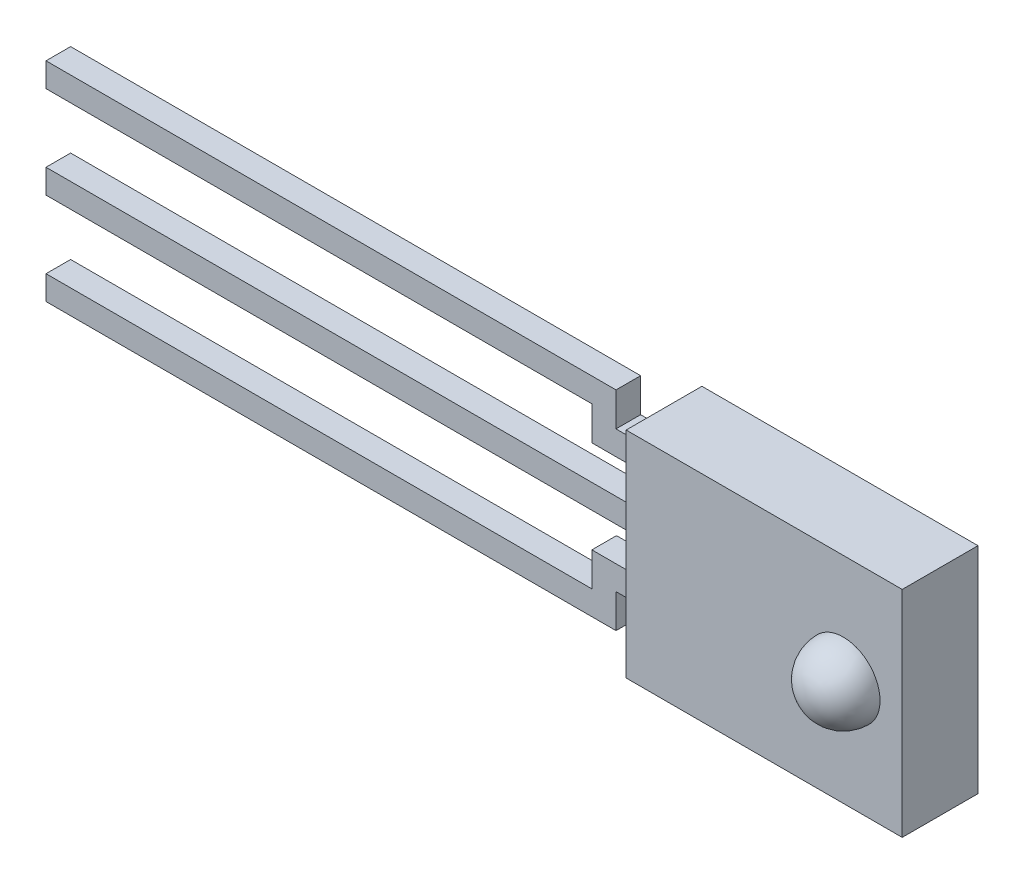
ISO-10303-21;
HEADER;
FILE_DESCRIPTION(('STEP AP214'),'2;1');
FILE_NAME('part.step','',(''),(''),'','','');
FILE_SCHEMA(('AUTOMOTIVE_DESIGN { 1 0 10303 214 1 1 1 1 }'));
ENDSEC;
DATA;
#1=APPLICATION_CONTEXT('core data for automotive mechanical design processes');
#2=APPLICATION_PROTOCOL_DEFINITION('international standard','automotive_design',2000,#1);
#3=PRODUCT_CONTEXT('',#1,'mechanical');
#4=PRODUCT('Part','Part','',(#3));
#5=PRODUCT_RELATED_PRODUCT_CATEGORY('part','',(#4));
#6=PRODUCT_DEFINITION_FORMATION('','',#4);
#7=PRODUCT_DEFINITION_CONTEXT('part definition',#1,'design');
#8=PRODUCT_DEFINITION('design','',#6,#7);
#9=PRODUCT_DEFINITION_SHAPE('','',#8);
#10=(LENGTH_UNIT() NAMED_UNIT(*) SI_UNIT(.MILLI.,.METRE.));
#11=(NAMED_UNIT(*) PLANE_ANGLE_UNIT() SI_UNIT($,.RADIAN.));
#12=(NAMED_UNIT(*) SI_UNIT($,.STERADIAN.) SOLID_ANGLE_UNIT());
#13=UNCERTAINTY_MEASURE_WITH_UNIT(LENGTH_MEASURE(1.E-05),#10,'distance_accuracy_value','');
#14=(GEOMETRIC_REPRESENTATION_CONTEXT(3) GLOBAL_UNCERTAINTY_ASSIGNED_CONTEXT((#13)) GLOBAL_UNIT_ASSIGNED_CONTEXT((#10,
#11,#12)) REPRESENTATION_CONTEXT('',''));
#15=CARTESIAN_POINT('',(0.,0.,0.));
#16=DIRECTION('',(0.,0.,1.));
#17=DIRECTION('',(1.,0.,0.));
#18=AXIS2_PLACEMENT_3D('',#15,#16,#17);
#19=CARTESIAN_POINT('',(-4.5,2.225,1.57));
#20=DIRECTION('',(1.,0.,0.));
#21=DIRECTION('',(0.,1.,0.));
#22=AXIS2_PLACEMENT_3D('',#19,#20,#21);
#23=PLANE('',#22);
#24=DIRECTION('',(0.,0.,1.));
#25=VECTOR('',#24,1.);
#26=CARTESIAN_POINT('',(-4.5,-0.250000000000001,0.38));
#27=LINE('',#26,#25);
#28=CARTESIAN_POINT('',(-4.5,-0.250000000000001,0.38));
#29=VERTEX_POINT('',#28);
#30=CARTESIAN_POINT('',(-4.5,-0.250000000000002,0.89));
#31=VERTEX_POINT('',#30);
#32=EDGE_CURVE('E51',#29,#31,#27,.T.);
#33=ORIENTED_EDGE('',*,*,#32,.F.);
#34=DIRECTION('',(0.,1.,0.));
#35=VECTOR('',#34,1.);
#36=CARTESIAN_POINT('',(-4.5,0.249999999999999,0.38));
#37=LINE('',#36,#35);
#38=CARTESIAN_POINT('',(-4.5,0.249999999999999,0.38));
#39=VERTEX_POINT('',#38);
#40=EDGE_CURVE('E55',#29,#39,#37,.T.);
#41=ORIENTED_EDGE('',*,*,#40,.T.);
#42=DIRECTION('',(0.,0.,1.));
#43=VECTOR('',#42,1.);
#44=CARTESIAN_POINT('',(-4.5,0.249999999999999,0.38));
#45=LINE('',#44,#43);
#46=CARTESIAN_POINT('',(-4.5,0.249999999999999,0.89));
#47=VERTEX_POINT('',#46);
#48=EDGE_CURVE('E207',#39,#47,#45,.T.);
#49=ORIENTED_EDGE('',*,*,#48,.T.);
#50=DIRECTION('',(0.,1.,0.));
#51=VECTOR('',#50,1.);
#52=CARTESIAN_POINT('',(-4.5,0.249999999999999,0.89));
#53=LINE('',#52,#51);
#54=EDGE_CURVE('E222',#31,#47,#53,.T.);
#55=ORIENTED_EDGE('',*,*,#54,.F.);
#56=EDGE_LOOP('',(#33,#41,#49,#55));
#57=FACE_BOUND('',#56,.T.);
#58=DIRECTION('',(0.,1.,0.));
#59=VECTOR('',#58,1.);
#60=CARTESIAN_POINT('',(-4.5,0.959999999999998,0.38));
#61=LINE('',#60,#59);
#62=CARTESIAN_POINT('',(-4.5,0.959999999999998,0.38));
#63=VERTEX_POINT('',#62);
#64=CARTESIAN_POINT('',(-4.5,1.46,0.38));
#65=VERTEX_POINT('',#64);
#66=EDGE_CURVE('E291',#63,#65,#61,.T.);
#67=ORIENTED_EDGE('',*,*,#66,.T.);
#68=DIRECTION('',(0.,0.,1.));
#69=VECTOR('',#68,1.);
#70=CARTESIAN_POINT('',(-4.5,1.46,0.38));
#71=LINE('',#70,#69);
#72=CARTESIAN_POINT('',(-4.5,1.46,0.89));
#73=VERTEX_POINT('',#72);
#74=EDGE_CURVE('E316',#65,#73,#71,.T.);
#75=ORIENTED_EDGE('',*,*,#74,.T.);
#76=DIRECTION('',(0.,1.,0.));
#77=VECTOR('',#76,1.);
#78=CARTESIAN_POINT('',(-4.5,0.959999999999998,0.89));
#79=LINE('',#78,#77);
#80=CARTESIAN_POINT('',(-4.5,0.959999999999998,0.89));
#81=VERTEX_POINT('',#80);
#82=EDGE_CURVE('E270',#81,#73,#79,.T.);
#83=ORIENTED_EDGE('',*,*,#82,.F.);
#84=DIRECTION('',(0.,0.,1.));
#85=VECTOR('',#84,1.);
#86=CARTESIAN_POINT('',(-4.5,0.959999999999998,0.38));
#87=LINE('',#86,#85);
#88=EDGE_CURVE('E338',#63,#81,#87,.T.);
#89=ORIENTED_EDGE('',*,*,#88,.F.);
#90=EDGE_LOOP('',(#67,#75,#83,#89));
#91=FACE_BOUND('',#90,.T.);
#92=DIRECTION('',(0.,-1.,0.));
#93=VECTOR('',#92,1.);
#94=CARTESIAN_POINT('',(-4.5,2.225,0.));
#95=LINE('',#94,#93);
#96=CARTESIAN_POINT('',(-4.5,2.225,0.));
#97=VERTEX_POINT('',#96);
#98=CARTESIAN_POINT('',(-4.5,-2.225,0.));
#99=VERTEX_POINT('',#98);
#100=EDGE_CURVE('E371',#97,#99,#95,.T.);
#101=ORIENTED_EDGE('',*,*,#100,.T.);
#102=DIRECTION('',(0.,0.,-1.));
#103=VECTOR('',#102,1.);
#104=CARTESIAN_POINT('',(-4.5,-2.225,1.57));
#105=LINE('',#104,#103);
#106=CARTESIAN_POINT('',(-4.5,-2.225,1.57));
#107=VERTEX_POINT('',#106);
#108=EDGE_CURVE('E376',#107,#99,#105,.T.);
#109=ORIENTED_EDGE('',*,*,#108,.F.);
#110=DIRECTION('',(0.,-1.,0.));
#111=VECTOR('',#110,1.);
#112=CARTESIAN_POINT('',(-4.5,2.225,1.57));
#113=LINE('',#112,#111);
#114=CARTESIAN_POINT('',(-4.5,2.225,1.57));
#115=VERTEX_POINT('',#114);
#116=EDGE_CURVE('E361',#115,#107,#113,.T.);
#117=ORIENTED_EDGE('',*,*,#116,.F.);
#118=DIRECTION('',(0.,0.,-1.));
#119=VECTOR('',#118,1.);
#120=CARTESIAN_POINT('',(-4.5,2.225,1.57));
#121=LINE('',#120,#119);
#122=EDGE_CURVE('E44',#115,#97,#121,.T.);
#123=ORIENTED_EDGE('',*,*,#122,.T.);
#124=EDGE_LOOP('',(#101,#109,#117,#123));
#125=FACE_BOUND('',#124,.T.);
#126=DIRECTION('',(0.,-1.,0.));
#127=VECTOR('',#126,1.);
#128=CARTESIAN_POINT('',(-4.5,-0.959999999999998,0.38));
#129=LINE('',#128,#127);
#130=CARTESIAN_POINT('',(-4.5,-0.959999999999998,0.38));
#131=VERTEX_POINT('',#130);
#132=CARTESIAN_POINT('',(-4.5,-1.46,0.38));
#133=VERTEX_POINT('',#132);
#134=EDGE_CURVE('E234',#131,#133,#129,.T.);
#135=ORIENTED_EDGE('',*,*,#134,.F.);
#136=DIRECTION('',(0.,0.,1.));
#137=VECTOR('',#136,1.);
#138=CARTESIAN_POINT('',(-4.5,-0.959999999999998,0.38));
#139=LINE('',#138,#137);
#140=CARTESIAN_POINT('',(-4.5,-0.959999999999998,0.89));
#141=VERTEX_POINT('',#140);
#142=EDGE_CURVE('E252',#131,#141,#139,.T.);
#143=ORIENTED_EDGE('',*,*,#142,.T.);
#144=DIRECTION('',(0.,-1.,0.));
#145=VECTOR('',#144,1.);
#146=CARTESIAN_POINT('',(-4.5,-0.959999999999998,0.89));
#147=LINE('',#146,#145);
#148=CARTESIAN_POINT('',(-4.5,-1.46,0.89));
#149=VERTEX_POINT('',#148);
#150=EDGE_CURVE('E231',#141,#149,#147,.T.);
#151=ORIENTED_EDGE('',*,*,#150,.T.);
#152=DIRECTION('',(0.,0.,1.));
#153=VECTOR('',#152,1.);
#154=CARTESIAN_POINT('',(-4.5,-1.46,0.38));
#155=LINE('',#154,#153);
#156=EDGE_CURVE('E268',#133,#149,#155,.T.);
#157=ORIENTED_EDGE('',*,*,#156,.F.);
#158=EDGE_LOOP('',(#135,#143,#151,#157));
#159=FACE_BOUND('',#158,.T.);
#160=ADVANCED_FACE('F35',(#57,#91,#125,#159),#23,.F.);
#161=CARTESIAN_POINT('',(1.22,2.225,1.57));
#162=DIRECTION('',(-1.,0.,0.));
#163=DIRECTION('',(0.,-1.,0.));
#164=AXIS2_PLACEMENT_3D('',#161,#162,#163);
#165=PLANE('',#164);
#166=DIRECTION('',(0.,1.,0.));
#167=VECTOR('',#166,1.);
#168=CARTESIAN_POINT('',(1.22,2.225,0.));
#169=LINE('',#168,#167);
#170=CARTESIAN_POINT('',(1.22,-2.225,0.));
#171=VERTEX_POINT('',#170);
#172=CARTESIAN_POINT('',(1.22,2.225,0.));
#173=VERTEX_POINT('',#172);
#174=EDGE_CURVE('E366',#171,#173,#169,.T.);
#175=ORIENTED_EDGE('',*,*,#174,.T.);
#176=DIRECTION('',(0.,0.,-1.));
#177=VECTOR('',#176,1.);
#178=CARTESIAN_POINT('',(1.22,2.225,1.57));
#179=LINE('',#178,#177);
#180=CARTESIAN_POINT('',(1.22,2.225,1.57));
#181=VERTEX_POINT('',#180);
#182=EDGE_CURVE('E11',#181,#173,#179,.T.);
#183=ORIENTED_EDGE('',*,*,#182,.F.);
#184=DIRECTION('',(0.,1.,0.));
#185=VECTOR('',#184,1.);
#186=CARTESIAN_POINT('',(1.22,2.225,1.57));
#187=LINE('',#186,#185);
#188=CARTESIAN_POINT('',(1.22,-2.225,1.57));
#189=VERTEX_POINT('',#188);
#190=EDGE_CURVE('E355',#189,#181,#187,.T.);
#191=ORIENTED_EDGE('',*,*,#190,.F.);
#192=DIRECTION('',(0.,0.,-1.));
#193=VECTOR('',#192,1.);
#194=CARTESIAN_POINT('',(1.22,-2.225,1.57));
#195=LINE('',#194,#193);
#196=EDGE_CURVE('E365',#189,#171,#195,.T.);
#197=ORIENTED_EDGE('',*,*,#196,.T.);
#198=EDGE_LOOP('',(#175,#183,#191,#197));
#199=FACE_BOUND('',#198,.T.);
#200=ADVANCED_FACE('F37',(#199),#165,.F.);
#201=CARTESIAN_POINT('',(-4.5,2.225,1.57));
#202=DIRECTION('',(0.,-1.,0.));
#203=DIRECTION('',(0.,0.,-1.));
#204=AXIS2_PLACEMENT_3D('',#201,#202,#203);
#205=PLANE('',#204);
#206=DIRECTION('',(-1.,0.,0.));
#207=VECTOR('',#206,1.);
#208=CARTESIAN_POINT('',(-4.5,2.225,0.));
#209=LINE('',#208,#207);
#210=EDGE_CURVE('E369',#173,#97,#209,.T.);
#211=ORIENTED_EDGE('',*,*,#210,.T.);
#212=ORIENTED_EDGE('',*,*,#122,.F.);
#213=DIRECTION('',(-1.,0.,0.));
#214=VECTOR('',#213,1.);
#215=CARTESIAN_POINT('',(-4.5,2.225,1.57));
#216=LINE('',#215,#214);
#217=EDGE_CURVE('E358',#181,#115,#216,.T.);
#218=ORIENTED_EDGE('',*,*,#217,.F.);
#219=ORIENTED_EDGE('',*,*,#182,.T.);
#220=EDGE_LOOP('',(#211,#212,#218,#219));
#221=FACE_BOUND('',#220,.T.);
#222=ADVANCED_FACE('F400',(#221),#205,.F.);
#223=CARTESIAN_POINT('',(-4.5,-2.225,1.57));
#224=DIRECTION('',(0.,1.,0.));
#225=DIRECTION('',(0.,0.,1.));
#226=AXIS2_PLACEMENT_3D('',#223,#224,#225);
#227=PLANE('',#226);
#228=DIRECTION('',(1.,0.,0.));
#229=VECTOR('',#228,1.);
#230=CARTESIAN_POINT('',(-4.5,-2.225,0.));
#231=LINE('',#230,#229);
#232=EDGE_CURVE('E359',#99,#171,#231,.T.);
#233=ORIENTED_EDGE('',*,*,#232,.T.);
#234=ORIENTED_EDGE('',*,*,#196,.F.);
#235=DIRECTION('',(1.,0.,0.));
#236=VECTOR('',#235,1.);
#237=CARTESIAN_POINT('',(-4.5,-2.225,1.57));
#238=LINE('',#237,#236);
#239=EDGE_CURVE('E363',#107,#189,#238,.T.);
#240=ORIENTED_EDGE('',*,*,#239,.F.);
#241=ORIENTED_EDGE('',*,*,#108,.T.);
#242=EDGE_LOOP('',(#233,#234,#240,#241));
#243=FACE_BOUND('',#242,.T.);
#244=ADVANCED_FACE('F393',(#243),#227,.F.);
#245=CARTESIAN_POINT('',(0.,0.,1.57));
#246=DIRECTION('',(0.,0.,1.));
#247=DIRECTION('',(1.,0.,0.));
#248=AXIS2_PLACEMENT_3D('',#245,#246,#247);
#249=PLANE('',#248);
#250=CARTESIAN_POINT('',(0.,0.,1.57));
#251=DIRECTION('',(0.,0.,1.));
#252=DIRECTION('',(1.,0.,0.));
#253=AXIS2_PLACEMENT_3D('',#250,#251,#252);
#254=CIRCLE('',#253,0.76);
#255=CARTESIAN_POINT('',(0.76,0.,1.57));
#256=VERTEX_POINT('',#255);
#257=EDGE_CURVE('E39',#256,#256,#254,.F.);
#258=ORIENTED_EDGE('',*,*,#257,.T.);
#259=EDGE_LOOP('',(#258));
#260=FACE_BOUND('',#259,.T.);
#261=ORIENTED_EDGE('',*,*,#190,.T.);
#262=ORIENTED_EDGE('',*,*,#217,.T.);
#263=ORIENTED_EDGE('',*,*,#116,.T.);
#264=ORIENTED_EDGE('',*,*,#239,.T.);
#265=EDGE_LOOP('',(#261,#262,#263,#264));
#266=FACE_BOUND('',#265,.T.);
#267=ADVANCED_FACE('F399',(#260,#266),#249,.T.);
#268=CARTESIAN_POINT('',(0.,0.,0.));
#269=DIRECTION('',(0.,0.,1.));
#270=DIRECTION('',(1.,0.,0.));
#271=AXIS2_PLACEMENT_3D('',#268,#269,#270);
#272=PLANE('',#271);
#273=ORIENTED_EDGE('',*,*,#174,.F.);
#274=ORIENTED_EDGE('',*,*,#232,.F.);
#275=ORIENTED_EDGE('',*,*,#100,.F.);
#276=ORIENTED_EDGE('',*,*,#210,.F.);
#277=EDGE_LOOP('',(#273,#274,#275,#276));
#278=FACE_BOUND('',#277,.T.);
#279=ADVANCED_FACE('F390',(#278),#272,.F.);
#280=CARTESIAN_POINT('',(0.,0.,1.57));
#281=DIRECTION('',(0.,0.,-1.));
#282=DIRECTION('',(-1.,0.,0.));
#283=AXIS2_PLACEMENT_3D('',#280,#281,#282);
#284=SPHERICAL_SURFACE('',#283,0.76);
#285=ORIENTED_EDGE('',*,*,#257,.F.);
#286=EDGE_LOOP('',(#285));
#287=FACE_BOUND('',#286,.T.);
#288=ADVANCED_FACE('F415',(#287),#284,.T.);
#289=CARTESIAN_POINT('',(-5.89,0.959999999999998,0.38));
#290=DIRECTION('',(0.,-1.,0.));
#291=DIRECTION('',(1.,0.,0.));
#292=AXIS2_PLACEMENT_3D('',#289,#290,#291);
#293=PLANE('',#292);
#294=DIRECTION('',(1.,0.,0.));
#295=VECTOR('',#294,1.);
#296=CARTESIAN_POINT('',(-5.89,0.959999999999998,0.89));
#297=LINE('',#296,#295);
#298=CARTESIAN_POINT('',(-5.89,0.959999999999998,0.89));
#299=VERTEX_POINT('',#298);
#300=EDGE_CURVE('E295',#299,#81,#297,.T.);
#301=ORIENTED_EDGE('',*,*,#300,.F.);
#302=DIRECTION('',(0.,0.,1.));
#303=VECTOR('',#302,1.);
#304=CARTESIAN_POINT('',(-5.89,0.959999999999998,0.38));
#305=LINE('',#304,#303);
#306=CARTESIAN_POINT('',(-5.89,0.959999999999998,0.38));
#307=VERTEX_POINT('',#306);
#308=EDGE_CURVE('E341',#307,#299,#305,.T.);
#309=ORIENTED_EDGE('',*,*,#308,.F.);
#310=DIRECTION('',(1.,0.,0.));
#311=VECTOR('',#310,1.);
#312=CARTESIAN_POINT('',(-5.89,0.959999999999998,0.38));
#313=LINE('',#312,#311);
#314=EDGE_CURVE('E313',#307,#63,#313,.T.);
#315=ORIENTED_EDGE('',*,*,#314,.T.);
#316=ORIENTED_EDGE('',*,*,#88,.T.);
#317=EDGE_LOOP('',(#301,#309,#315,#316));
#318=FACE_BOUND('',#317,.T.);
#319=ADVANCED_FACE('F421',(#318),#293,.T.);
#320=CARTESIAN_POINT('',(-5.89,1.66,0.38));
#321=DIRECTION('',(-1.,0.,0.));
#322=DIRECTION('',(0.,0.,1.));
#323=AXIS2_PLACEMENT_3D('',#320,#321,#322);
#324=PLANE('',#323);
#325=DIRECTION('',(0.,-1.,0.));
#326=VECTOR('',#325,1.);
#327=CARTESIAN_POINT('',(-5.89,1.66,0.89));
#328=LINE('',#327,#326);
#329=CARTESIAN_POINT('',(-5.89,1.66,0.89));
#330=VERTEX_POINT('',#329);
#331=EDGE_CURVE('E334',#330,#299,#328,.T.);
#332=ORIENTED_EDGE('',*,*,#331,.F.);
#333=DIRECTION('',(0.,0.,1.));
#334=VECTOR('',#333,1.);
#335=CARTESIAN_POINT('',(-5.89,1.66,0.38));
#336=LINE('',#335,#334);
#337=CARTESIAN_POINT('',(-5.89,1.66,0.38));
#338=VERTEX_POINT('',#337);
#339=EDGE_CURVE('E343',#338,#330,#336,.T.);
#340=ORIENTED_EDGE('',*,*,#339,.F.);
#341=DIRECTION('',(0.,-1.,0.));
#342=VECTOR('',#341,1.);
#343=CARTESIAN_POINT('',(-5.89,1.66,0.38));
#344=LINE('',#343,#342);
#345=EDGE_CURVE('E310',#338,#307,#344,.T.);
#346=ORIENTED_EDGE('',*,*,#345,.T.);
#347=ORIENTED_EDGE('',*,*,#308,.T.);
#348=EDGE_LOOP('',(#332,#340,#346,#347));
#349=FACE_BOUND('',#348,.T.);
#350=ADVANCED_FACE('F443',(#349),#324,.T.);
#351=CARTESIAN_POINT('',(-17.2,1.66,0.38));
#352=DIRECTION('',(0.,-1.,0.));
#353=DIRECTION('',(0.,0.,-1.));
#354=AXIS2_PLACEMENT_3D('',#351,#352,#353);
#355=PLANE('',#354);
#356=DIRECTION('',(1.,0.,0.));
#357=VECTOR('',#356,1.);
#358=CARTESIAN_POINT('',(-17.2,1.66,0.89));
#359=LINE('',#358,#357);
#360=CARTESIAN_POINT('',(-17.2,1.66,0.89));
#361=VERTEX_POINT('',#360);
#362=EDGE_CURVE('E331',#361,#330,#359,.T.);
#363=ORIENTED_EDGE('',*,*,#362,.F.);
#364=DIRECTION('',(0.,0.,1.));
#365=VECTOR('',#364,1.);
#366=CARTESIAN_POINT('',(-17.2,1.66,0.38));
#367=LINE('',#366,#365);
#368=CARTESIAN_POINT('',(-17.2,1.66,0.38));
#369=VERTEX_POINT('',#368);
#370=EDGE_CURVE('E345',#369,#361,#367,.T.);
#371=ORIENTED_EDGE('',*,*,#370,.F.);
#372=DIRECTION('',(1.,0.,0.));
#373=VECTOR('',#372,1.);
#374=CARTESIAN_POINT('',(-17.2,1.66,0.38));
#375=LINE('',#374,#373);
#376=EDGE_CURVE('E307',#369,#338,#375,.T.);
#377=ORIENTED_EDGE('',*,*,#376,.T.);
#378=ORIENTED_EDGE('',*,*,#339,.T.);
#379=EDGE_LOOP('',(#363,#371,#377,#378));
#380=FACE_BOUND('',#379,.T.);
#381=ADVANCED_FACE('F439',(#380),#355,.T.);
#382=CARTESIAN_POINT('',(-17.2,2.16,0.38));
#383=DIRECTION('',(-1.,0.,0.));
#384=DIRECTION('',(0.,0.,1.));
#385=AXIS2_PLACEMENT_3D('',#382,#383,#384);
#386=PLANE('',#385);
#387=DIRECTION('',(0.,-1.,0.));
#388=VECTOR('',#387,1.);
#389=CARTESIAN_POINT('',(-17.2,2.16,0.89));
#390=LINE('',#389,#388);
#391=CARTESIAN_POINT('',(-17.2,2.16,0.89));
#392=VERTEX_POINT('',#391);
#393=EDGE_CURVE('E328',#392,#361,#390,.T.);
#394=ORIENTED_EDGE('',*,*,#393,.F.);
#395=DIRECTION('',(0.,0.,1.));
#396=VECTOR('',#395,1.);
#397=CARTESIAN_POINT('',(-17.2,2.16,0.38));
#398=LINE('',#397,#396);
#399=CARTESIAN_POINT('',(-17.2,2.16,0.38));
#400=VERTEX_POINT('',#399);
#401=EDGE_CURVE('E347',#400,#392,#398,.T.);
#402=ORIENTED_EDGE('',*,*,#401,.F.);
#403=DIRECTION('',(0.,-1.,0.));
#404=VECTOR('',#403,1.);
#405=CARTESIAN_POINT('',(-17.2,2.16,0.38));
#406=LINE('',#405,#404);
#407=EDGE_CURVE('E304',#400,#369,#406,.T.);
#408=ORIENTED_EDGE('',*,*,#407,.T.);
#409=ORIENTED_EDGE('',*,*,#370,.T.);
#410=EDGE_LOOP('',(#394,#402,#408,#409));
#411=FACE_BOUND('',#410,.T.);
#412=ADVANCED_FACE('F435',(#411),#386,.T.);
#413=CARTESIAN_POINT('',(-5.39,2.16,0.38));
#414=DIRECTION('',(0.,1.,0.));
#415=DIRECTION('',(-1.,0.,0.));
#416=AXIS2_PLACEMENT_3D('',#413,#414,#415);
#417=PLANE('',#416);
#418=DIRECTION('',(-1.,0.,0.));
#419=VECTOR('',#418,1.);
#420=CARTESIAN_POINT('',(-5.39,2.16,0.89));
#421=LINE('',#420,#419);
#422=CARTESIAN_POINT('',(-5.39,2.16,0.89));
#423=VERTEX_POINT('',#422);
#424=EDGE_CURVE('E325',#423,#392,#421,.T.);
#425=ORIENTED_EDGE('',*,*,#424,.F.);
#426=DIRECTION('',(0.,0.,1.));
#427=VECTOR('',#426,1.);
#428=CARTESIAN_POINT('',(-5.39,2.16,0.38));
#429=LINE('',#428,#427);
#430=CARTESIAN_POINT('',(-5.39,2.16,0.38));
#431=VERTEX_POINT('',#430);
#432=EDGE_CURVE('E349',#431,#423,#429,.T.);
#433=ORIENTED_EDGE('',*,*,#432,.F.);
#434=DIRECTION('',(-1.,0.,0.));
#435=VECTOR('',#434,1.);
#436=CARTESIAN_POINT('',(-5.39,2.16,0.38));
#437=LINE('',#436,#435);
#438=EDGE_CURVE('E301',#431,#400,#437,.T.);
#439=ORIENTED_EDGE('',*,*,#438,.T.);
#440=ORIENTED_EDGE('',*,*,#401,.T.);
#441=EDGE_LOOP('',(#425,#433,#439,#440));
#442=FACE_BOUND('',#441,.T.);
#443=ADVANCED_FACE('F431',(#442),#417,.T.);
#444=CARTESIAN_POINT('',(-5.39,1.46,0.38));
#445=DIRECTION('',(1.,0.,0.));
#446=DIRECTION('',(0.,0.,-1.));
#447=AXIS2_PLACEMENT_3D('',#444,#445,#446);
#448=PLANE('',#447);
#449=DIRECTION('',(0.,1.,0.));
#450=VECTOR('',#449,1.);
#451=CARTESIAN_POINT('',(-5.39,1.46,0.89));
#452=LINE('',#451,#450);
#453=CARTESIAN_POINT('',(-5.39,1.46,0.89));
#454=VERTEX_POINT('',#453);
#455=EDGE_CURVE('E322',#454,#423,#452,.T.);
#456=ORIENTED_EDGE('',*,*,#455,.F.);
#457=DIRECTION('',(0.,0.,1.));
#458=VECTOR('',#457,1.);
#459=CARTESIAN_POINT('',(-5.39,1.46,0.38));
#460=LINE('',#459,#458);
#461=CARTESIAN_POINT('',(-5.39,1.46,0.38));
#462=VERTEX_POINT('',#461);
#463=EDGE_CURVE('E351',#462,#454,#460,.T.);
#464=ORIENTED_EDGE('',*,*,#463,.F.);
#465=DIRECTION('',(0.,1.,0.));
#466=VECTOR('',#465,1.);
#467=CARTESIAN_POINT('',(-5.39,1.46,0.38));
#468=LINE('',#467,#466);
#469=EDGE_CURVE('E298',#462,#431,#468,.T.);
#470=ORIENTED_EDGE('',*,*,#469,.T.);
#471=ORIENTED_EDGE('',*,*,#432,.T.);
#472=EDGE_LOOP('',(#456,#464,#470,#471));
#473=FACE_BOUND('',#472,.T.);
#474=ADVANCED_FACE('F427',(#473),#448,.T.);
#475=CARTESIAN_POINT('',(-4.5,1.46,0.38));
#476=DIRECTION('',(0.,1.,0.));
#477=DIRECTION('',(-1.,0.,0.));
#478=AXIS2_PLACEMENT_3D('',#475,#476,#477);
#479=PLANE('',#478);
#480=DIRECTION('',(-1.,0.,0.));
#481=VECTOR('',#480,1.);
#482=CARTESIAN_POINT('',(-4.5,1.46,0.89));
#483=LINE('',#482,#481);
#484=EDGE_CURVE('E319',#73,#454,#483,.T.);
#485=ORIENTED_EDGE('',*,*,#484,.F.);
#486=ORIENTED_EDGE('',*,*,#74,.F.);
#487=DIRECTION('',(-1.,0.,0.));
#488=VECTOR('',#487,1.);
#489=CARTESIAN_POINT('',(-4.5,1.46,0.38));
#490=LINE('',#489,#488);
#491=EDGE_CURVE('E294',#65,#462,#490,.T.);
#492=ORIENTED_EDGE('',*,*,#491,.T.);
#493=ORIENTED_EDGE('',*,*,#463,.T.);
#494=EDGE_LOOP('',(#485,#486,#492,#493));
#495=FACE_BOUND('',#494,.T.);
#496=ADVANCED_FACE('F423',(#495),#479,.T.);
#497=CARTESIAN_POINT('',(0.,0.,0.38));
#498=DIRECTION('',(0.,0.,1.));
#499=DIRECTION('',(1.,0.,0.));
#500=AXIS2_PLACEMENT_3D('',#497,#498,#499);
#501=PLANE('',#500);
#502=ORIENTED_EDGE('',*,*,#66,.F.);
#503=ORIENTED_EDGE('',*,*,#314,.F.);
#504=ORIENTED_EDGE('',*,*,#345,.F.);
#505=ORIENTED_EDGE('',*,*,#376,.F.);
#506=ORIENTED_EDGE('',*,*,#407,.F.);
#507=ORIENTED_EDGE('',*,*,#438,.F.);
#508=ORIENTED_EDGE('',*,*,#469,.F.);
#509=ORIENTED_EDGE('',*,*,#491,.F.);
#510=EDGE_LOOP('',(#502,#503,#504,#505,#506,#507,#508,#509));
#511=FACE_BOUND('',#510,.T.);
#512=ADVANCED_FACE('F426',(#511),#501,.F.);
#513=CARTESIAN_POINT('',(0.,0.,0.89));
#514=DIRECTION('',(0.,0.,1.));
#515=DIRECTION('',(1.,0.,0.));
#516=AXIS2_PLACEMENT_3D('',#513,#514,#515);
#517=PLANE('',#516);
#518=ORIENTED_EDGE('',*,*,#82,.T.);
#519=ORIENTED_EDGE('',*,*,#484,.T.);
#520=ORIENTED_EDGE('',*,*,#455,.T.);
#521=ORIENTED_EDGE('',*,*,#424,.T.);
#522=ORIENTED_EDGE('',*,*,#393,.T.);
#523=ORIENTED_EDGE('',*,*,#362,.T.);
#524=ORIENTED_EDGE('',*,*,#331,.T.);
#525=ORIENTED_EDGE('',*,*,#300,.T.);
#526=EDGE_LOOP('',(#518,#519,#520,#521,#522,#523,#524,#525));
#527=FACE_BOUND('',#526,.T.);
#528=ADVANCED_FACE('F451',(#527),#517,.T.);
#529=CARTESIAN_POINT('',(-4.5,-1.46,0.38));
#530=DIRECTION('',(0.,1.,0.));
#531=DIRECTION('',(-1.,0.,0.));
#532=AXIS2_PLACEMENT_3D('',#529,#530,#531);
#533=PLANE('',#532);
#534=DIRECTION('',(-1.,0.,0.));
#535=VECTOR('',#534,1.);
#536=CARTESIAN_POINT('',(-4.5,-1.46,0.89));
#537=LINE('',#536,#535);
#538=CARTESIAN_POINT('',(-5.39,-1.46,0.89));
#539=VERTEX_POINT('',#538);
#540=EDGE_CURVE('E238',#149,#539,#537,.T.);
#541=ORIENTED_EDGE('',*,*,#540,.T.);
#542=DIRECTION('',(0.,0.,1.));
#543=VECTOR('',#542,1.);
#544=CARTESIAN_POINT('',(-5.39,-1.46,0.38));
#545=LINE('',#544,#543);
#546=CARTESIAN_POINT('',(-5.39,-1.46,0.38));
#547=VERTEX_POINT('',#546);
#548=EDGE_CURVE('E271',#547,#539,#545,.T.);
#549=ORIENTED_EDGE('',*,*,#548,.F.);
#550=DIRECTION('',(-1.,0.,0.));
#551=VECTOR('',#550,1.);
#552=CARTESIAN_POINT('',(-4.5,-1.46,0.38));
#553=LINE('',#552,#551);
#554=EDGE_CURVE('E250',#133,#547,#553,.T.);
#555=ORIENTED_EDGE('',*,*,#554,.F.);
#556=ORIENTED_EDGE('',*,*,#156,.T.);
#557=EDGE_LOOP('',(#541,#549,#555,#556));
#558=FACE_BOUND('',#557,.T.);
#559=ADVANCED_FACE('F454',(#558),#533,.F.);
#560=CARTESIAN_POINT('',(-5.39,-1.46,0.38));
#561=DIRECTION('',(-1.,0.,0.));
#562=DIRECTION('',(0.,0.,1.));
#563=AXIS2_PLACEMENT_3D('',#560,#561,#562);
#564=PLANE('',#563);
#565=DIRECTION('',(0.,-1.,0.));
#566=VECTOR('',#565,1.);
#567=CARTESIAN_POINT('',(-5.39,-1.46,0.89));
#568=LINE('',#567,#566);
#569=CARTESIAN_POINT('',(-5.39,-2.16,0.89));
#570=VERTEX_POINT('',#569);
#571=EDGE_CURVE('E265',#539,#570,#568,.T.);
#572=ORIENTED_EDGE('',*,*,#571,.T.);
#573=DIRECTION('',(0.,0.,1.));
#574=VECTOR('',#573,1.);
#575=CARTESIAN_POINT('',(-5.39,-2.16,0.38));
#576=LINE('',#575,#574);
#577=CARTESIAN_POINT('',(-5.39,-2.16,0.38));
#578=VERTEX_POINT('',#577);
#579=EDGE_CURVE('E274',#578,#570,#576,.T.);
#580=ORIENTED_EDGE('',*,*,#579,.F.);
#581=DIRECTION('',(0.,-1.,0.));
#582=VECTOR('',#581,1.);
#583=CARTESIAN_POINT('',(-5.39,-1.46,0.38));
#584=LINE('',#583,#582);
#585=EDGE_CURVE('E248',#547,#578,#584,.T.);
#586=ORIENTED_EDGE('',*,*,#585,.F.);
#587=ORIENTED_EDGE('',*,*,#548,.T.);
#588=EDGE_LOOP('',(#572,#580,#586,#587));
#589=FACE_BOUND('',#588,.T.);
#590=ADVANCED_FACE('F479',(#589),#564,.F.);
#591=CARTESIAN_POINT('',(-5.39,-2.16,0.38));
#592=DIRECTION('',(0.,1.,0.));
#593=DIRECTION('',(-1.,0.,0.));
#594=AXIS2_PLACEMENT_3D('',#591,#592,#593);
#595=PLANE('',#594);
#596=DIRECTION('',(-1.,0.,0.));
#597=VECTOR('',#596,1.);
#598=CARTESIAN_POINT('',(-5.39,-2.16,0.89));
#599=LINE('',#598,#597);
#600=CARTESIAN_POINT('',(-17.2,-2.16,0.89));
#601=VERTEX_POINT('',#600);
#602=EDGE_CURVE('E263',#570,#601,#599,.T.);
#603=ORIENTED_EDGE('',*,*,#602,.T.);
#604=DIRECTION('',(0.,0.,1.));
#605=VECTOR('',#604,1.);
#606=CARTESIAN_POINT('',(-17.2,-2.16,0.38));
#607=LINE('',#606,#605);
#608=CARTESIAN_POINT('',(-17.2,-2.16,0.38));
#609=VERTEX_POINT('',#608);
#610=EDGE_CURVE('E277',#609,#601,#607,.T.);
#611=ORIENTED_EDGE('',*,*,#610,.F.);
#612=DIRECTION('',(-1.,0.,0.));
#613=VECTOR('',#612,1.);
#614=CARTESIAN_POINT('',(-5.39,-2.16,0.38));
#615=LINE('',#614,#613);
#616=EDGE_CURVE('E246',#578,#609,#615,.T.);
#617=ORIENTED_EDGE('',*,*,#616,.F.);
#618=ORIENTED_EDGE('',*,*,#579,.T.);
#619=EDGE_LOOP('',(#603,#611,#617,#618));
#620=FACE_BOUND('',#619,.T.);
#621=ADVANCED_FACE('F475',(#620),#595,.F.);
#622=CARTESIAN_POINT('',(-17.2,-2.16,0.38));
#623=DIRECTION('',(1.,0.,0.));
#624=DIRECTION('',(0.,0.,-1.));
#625=AXIS2_PLACEMENT_3D('',#622,#623,#624);
#626=PLANE('',#625);
#627=DIRECTION('',(0.,1.,0.));
#628=VECTOR('',#627,1.);
#629=CARTESIAN_POINT('',(-17.2,-2.16,0.89));
#630=LINE('',#629,#628);
#631=CARTESIAN_POINT('',(-17.2,-1.66,0.89));
#632=VERTEX_POINT('',#631);
#633=EDGE_CURVE('E261',#601,#632,#630,.T.);
#634=ORIENTED_EDGE('',*,*,#633,.T.);
#635=DIRECTION('',(0.,0.,1.));
#636=VECTOR('',#635,1.);
#637=CARTESIAN_POINT('',(-17.2,-1.66,0.38));
#638=LINE('',#637,#636);
#639=CARTESIAN_POINT('',(-17.2,-1.66,0.38));
#640=VERTEX_POINT('',#639);
#641=EDGE_CURVE('E280',#640,#632,#638,.T.);
#642=ORIENTED_EDGE('',*,*,#641,.F.);
#643=DIRECTION('',(0.,1.,0.));
#644=VECTOR('',#643,1.);
#645=CARTESIAN_POINT('',(-17.2,-2.16,0.38));
#646=LINE('',#645,#644);
#647=EDGE_CURVE('E244',#609,#640,#646,.T.);
#648=ORIENTED_EDGE('',*,*,#647,.F.);
#649=ORIENTED_EDGE('',*,*,#610,.T.);
#650=EDGE_LOOP('',(#634,#642,#648,#649));
#651=FACE_BOUND('',#650,.T.);
#652=ADVANCED_FACE('F471',(#651),#626,.F.);
#653=CARTESIAN_POINT('',(-17.2,-1.66,0.38));
#654=DIRECTION('',(0.,-1.,0.));
#655=DIRECTION('',(0.,0.,-1.));
#656=AXIS2_PLACEMENT_3D('',#653,#654,#655);
#657=PLANE('',#656);
#658=DIRECTION('',(1.,0.,0.));
#659=VECTOR('',#658,1.);
#660=CARTESIAN_POINT('',(-17.2,-1.66,0.89));
#661=LINE('',#660,#659);
#662=CARTESIAN_POINT('',(-5.89,-1.66,0.89));
#663=VERTEX_POINT('',#662);
#664=EDGE_CURVE('E259',#632,#663,#661,.T.);
#665=ORIENTED_EDGE('',*,*,#664,.T.);
#666=DIRECTION('',(0.,0.,1.));
#667=VECTOR('',#666,1.);
#668=CARTESIAN_POINT('',(-5.89,-1.66,0.38));
#669=LINE('',#668,#667);
#670=CARTESIAN_POINT('',(-5.89,-1.66,0.38));
#671=VERTEX_POINT('',#670);
#672=EDGE_CURVE('E283',#671,#663,#669,.T.);
#673=ORIENTED_EDGE('',*,*,#672,.F.);
#674=DIRECTION('',(1.,0.,0.));
#675=VECTOR('',#674,1.);
#676=CARTESIAN_POINT('',(-17.2,-1.66,0.38));
#677=LINE('',#676,#675);
#678=EDGE_CURVE('E242',#640,#671,#677,.T.);
#679=ORIENTED_EDGE('',*,*,#678,.F.);
#680=ORIENTED_EDGE('',*,*,#641,.T.);
#681=EDGE_LOOP('',(#665,#673,#679,#680));
#682=FACE_BOUND('',#681,.T.);
#683=ADVANCED_FACE('F467',(#682),#657,.F.);
#684=CARTESIAN_POINT('',(-5.89,-1.66,0.38));
#685=DIRECTION('',(1.,0.,0.));
#686=DIRECTION('',(0.,0.,-1.));
#687=AXIS2_PLACEMENT_3D('',#684,#685,#686);
#688=PLANE('',#687);
#689=DIRECTION('',(0.,1.,0.));
#690=VECTOR('',#689,1.);
#691=CARTESIAN_POINT('',(-5.89,-1.66,0.89));
#692=LINE('',#691,#690);
#693=CARTESIAN_POINT('',(-5.89,-0.959999999999998,0.89));
#694=VERTEX_POINT('',#693);
#695=EDGE_CURVE('E257',#663,#694,#692,.T.);
#696=ORIENTED_EDGE('',*,*,#695,.T.);
#697=DIRECTION('',(0.,0.,1.));
#698=VECTOR('',#697,1.);
#699=CARTESIAN_POINT('',(-5.89,-0.959999999999998,0.38));
#700=LINE('',#699,#698);
#701=CARTESIAN_POINT('',(-5.89,-0.959999999999998,0.38));
#702=VERTEX_POINT('',#701);
#703=EDGE_CURVE('E286',#702,#694,#700,.T.);
#704=ORIENTED_EDGE('',*,*,#703,.F.);
#705=DIRECTION('',(0.,1.,0.));
#706=VECTOR('',#705,1.);
#707=CARTESIAN_POINT('',(-5.89,-1.66,0.38));
#708=LINE('',#707,#706);
#709=EDGE_CURVE('E240',#671,#702,#708,.T.);
#710=ORIENTED_EDGE('',*,*,#709,.F.);
#711=ORIENTED_EDGE('',*,*,#672,.T.);
#712=EDGE_LOOP('',(#696,#704,#710,#711));
#713=FACE_BOUND('',#712,.T.);
#714=ADVANCED_FACE('F463',(#713),#688,.F.);
#715=CARTESIAN_POINT('',(-5.89,-0.959999999999998,0.38));
#716=DIRECTION('',(0.,-1.,0.));
#717=DIRECTION('',(1.,0.,0.));
#718=AXIS2_PLACEMENT_3D('',#715,#716,#717);
#719=PLANE('',#718);
#720=DIRECTION('',(1.,0.,0.));
#721=VECTOR('',#720,1.);
#722=CARTESIAN_POINT('',(-5.89,-0.959999999999998,0.89));
#723=LINE('',#722,#721);
#724=EDGE_CURVE('E255',#694,#141,#723,.T.);
#725=ORIENTED_EDGE('',*,*,#724,.T.);
#726=ORIENTED_EDGE('',*,*,#142,.F.);
#727=DIRECTION('',(1.,0.,0.));
#728=VECTOR('',#727,1.);
#729=CARTESIAN_POINT('',(-5.89,-0.959999999999998,0.38));
#730=LINE('',#729,#728);
#731=EDGE_CURVE('E237',#702,#131,#730,.T.);
#732=ORIENTED_EDGE('',*,*,#731,.F.);
#733=ORIENTED_EDGE('',*,*,#703,.T.);
#734=EDGE_LOOP('',(#725,#726,#732,#733));
#735=FACE_BOUND('',#734,.T.);
#736=ADVANCED_FACE('F459',(#735),#719,.F.);
#737=CARTESIAN_POINT('',(0.,0.,0.38));
#738=DIRECTION('',(0.,0.,1.));
#739=DIRECTION('',(1.,0.,0.));
#740=AXIS2_PLACEMENT_3D('',#737,#738,#739);
#741=PLANE('',#740);
#742=ORIENTED_EDGE('',*,*,#134,.T.);
#743=ORIENTED_EDGE('',*,*,#554,.T.);
#744=ORIENTED_EDGE('',*,*,#585,.T.);
#745=ORIENTED_EDGE('',*,*,#616,.T.);
#746=ORIENTED_EDGE('',*,*,#647,.T.);
#747=ORIENTED_EDGE('',*,*,#678,.T.);
#748=ORIENTED_EDGE('',*,*,#709,.T.);
#749=ORIENTED_EDGE('',*,*,#731,.T.);
#750=EDGE_LOOP('',(#742,#743,#744,#745,#746,#747,#748,#749));
#751=FACE_BOUND('',#750,.T.);
#752=ADVANCED_FACE('F462',(#751),#741,.F.);
#753=CARTESIAN_POINT('',(0.,0.,0.89));
#754=DIRECTION('',(0.,0.,1.));
#755=DIRECTION('',(1.,0.,0.));
#756=AXIS2_PLACEMENT_3D('',#753,#754,#755);
#757=PLANE('',#756);
#758=ORIENTED_EDGE('',*,*,#150,.F.);
#759=ORIENTED_EDGE('',*,*,#724,.F.);
#760=ORIENTED_EDGE('',*,*,#695,.F.);
#761=ORIENTED_EDGE('',*,*,#664,.F.);
#762=ORIENTED_EDGE('',*,*,#633,.F.);
#763=ORIENTED_EDGE('',*,*,#602,.F.);
#764=ORIENTED_EDGE('',*,*,#571,.F.);
#765=ORIENTED_EDGE('',*,*,#540,.F.);
#766=EDGE_LOOP('',(#758,#759,#760,#761,#762,#763,#764,#765));
#767=FACE_BOUND('',#766,.T.);
#768=ADVANCED_FACE('F487',(#767),#757,.T.);
#769=CARTESIAN_POINT('',(-4.5,-0.250000000000001,0.38));
#770=DIRECTION('',(0.,-1.,0.));
#771=DIRECTION('',(1.,0.,0.));
#772=AXIS2_PLACEMENT_3D('',#769,#770,#771);
#773=PLANE('',#772);
#774=DIRECTION('',(1.,0.,0.));
#775=VECTOR('',#774,1.);
#776=CARTESIAN_POINT('',(-4.5,-0.250000000000001,0.89));
#777=LINE('',#776,#775);
#778=CARTESIAN_POINT('',(-17.2,-0.250000000000002,0.89));
#779=VERTEX_POINT('',#778);
#780=EDGE_CURVE('E218',#779,#31,#777,.T.);
#781=ORIENTED_EDGE('',*,*,#780,.F.);
#782=DIRECTION('',(0.,0.,1.));
#783=VECTOR('',#782,1.);
#784=CARTESIAN_POINT('',(-17.2,-0.250000000000002,0.38));
#785=LINE('',#784,#783);
#786=CARTESIAN_POINT('',(-17.2,-0.250000000000002,0.38));
#787=VERTEX_POINT('',#786);
#788=EDGE_CURVE('E206',#787,#779,#785,.T.);
#789=ORIENTED_EDGE('',*,*,#788,.F.);
#790=DIRECTION('',(1.,0.,0.));
#791=VECTOR('',#790,1.);
#792=CARTESIAN_POINT('',(-4.5,-0.250000000000001,0.38));
#793=LINE('',#792,#791);
#794=EDGE_CURVE('E214',#787,#29,#793,.T.);
#795=ORIENTED_EDGE('',*,*,#794,.T.);
#796=ORIENTED_EDGE('',*,*,#32,.T.);
#797=EDGE_LOOP('',(#781,#789,#795,#796));
#798=FACE_BOUND('',#797,.T.);
#799=ADVANCED_FACE('F490',(#798),#773,.T.);
#800=CARTESIAN_POINT('',(-17.2,0.249999999999998,0.38));
#801=DIRECTION('',(-1.,0.,0.));
#802=DIRECTION('',(0.,0.,1.));
#803=AXIS2_PLACEMENT_3D('',#800,#801,#802);
#804=PLANE('',#803);
#805=DIRECTION('',(0.,-1.,0.));
#806=VECTOR('',#805,1.);
#807=CARTESIAN_POINT('',(-17.2,0.249999999999998,0.89));
#808=LINE('',#807,#806);
#809=CARTESIAN_POINT('',(-17.2,0.249999999999998,0.89));
#810=VERTEX_POINT('',#809);
#811=EDGE_CURVE('E201',#810,#779,#808,.T.);
#812=ORIENTED_EDGE('',*,*,#811,.F.);
#813=DIRECTION('',(0.,0.,1.));
#814=VECTOR('',#813,1.);
#815=CARTESIAN_POINT('',(-17.2,0.249999999999998,0.38));
#816=LINE('',#815,#814);
#817=CARTESIAN_POINT('',(-17.2,0.249999999999998,0.38));
#818=VERTEX_POINT('',#817);
#819=EDGE_CURVE('E195',#818,#810,#816,.T.);
#820=ORIENTED_EDGE('',*,*,#819,.F.);
#821=DIRECTION('',(0.,-1.,0.));
#822=VECTOR('',#821,1.);
#823=CARTESIAN_POINT('',(-17.2,0.249999999999998,0.38));
#824=LINE('',#823,#822);
#825=EDGE_CURVE('E198',#818,#787,#824,.T.);
#826=ORIENTED_EDGE('',*,*,#825,.T.);
#827=ORIENTED_EDGE('',*,*,#788,.T.);
#828=EDGE_LOOP('',(#812,#820,#826,#827));
#829=FACE_BOUND('',#828,.T.);
#830=ADVANCED_FACE('F197',(#829),#804,.T.);
#831=CARTESIAN_POINT('',(-4.5,0.249999999999999,0.38));
#832=DIRECTION('',(0.,1.,0.));
#833=DIRECTION('',(-1.,0.,0.));
#834=AXIS2_PLACEMENT_3D('',#831,#832,#833);
#835=PLANE('',#834);
#836=DIRECTION('',(-1.,0.,0.));
#837=VECTOR('',#836,1.);
#838=CARTESIAN_POINT('',(-4.5,0.249999999999999,0.89));
#839=LINE('',#838,#837);
#840=EDGE_CURVE('E225',#47,#810,#839,.T.);
#841=ORIENTED_EDGE('',*,*,#840,.F.);
#842=ORIENTED_EDGE('',*,*,#48,.F.);
#843=DIRECTION('',(-1.,0.,0.));
#844=VECTOR('',#843,1.);
#845=CARTESIAN_POINT('',(-4.5,0.249999999999999,0.38));
#846=LINE('',#845,#844);
#847=EDGE_CURVE('E212',#39,#818,#846,.T.);
#848=ORIENTED_EDGE('',*,*,#847,.T.);
#849=ORIENTED_EDGE('',*,*,#819,.T.);
#850=EDGE_LOOP('',(#841,#842,#848,#849));
#851=FACE_BOUND('',#850,.T.);
#852=ADVANCED_FACE('F216',(#851),#835,.T.);
#853=CARTESIAN_POINT('',(0.,0.,0.38));
#854=DIRECTION('',(0.,0.,-1.));
#855=DIRECTION('',(-1.,0.,0.));
#856=AXIS2_PLACEMENT_3D('',#853,#854,#855);
#857=PLANE('',#856);
#858=ORIENTED_EDGE('',*,*,#40,.F.);
#859=ORIENTED_EDGE('',*,*,#794,.F.);
#860=ORIENTED_EDGE('',*,*,#825,.F.);
#861=ORIENTED_EDGE('',*,*,#847,.F.);
#862=EDGE_LOOP('',(#858,#859,#860,#861));
#863=FACE_BOUND('',#862,.T.);
#864=ADVANCED_FACE('F211',(#863),#857,.T.);
#865=CARTESIAN_POINT('',(0.,0.,0.89));
#866=DIRECTION('',(0.,0.,-1.));
#867=DIRECTION('',(-1.,0.,0.));
#868=AXIS2_PLACEMENT_3D('',#865,#866,#867);
#869=PLANE('',#868);
#870=ORIENTED_EDGE('',*,*,#54,.T.);
#871=ORIENTED_EDGE('',*,*,#840,.T.);
#872=ORIENTED_EDGE('',*,*,#811,.T.);
#873=ORIENTED_EDGE('',*,*,#780,.T.);
#874=EDGE_LOOP('',(#870,#871,#872,#873));
#875=FACE_BOUND('',#874,.T.);
#876=ADVANCED_FACE('F502',(#875),#869,.F.);
#877=CLOSED_SHELL('',(#160,#200,#222,#244,#267,#279,#288,#319,#350,#381,#412,#443,#474,#496,
#512,#528,#559,#590,#621,#652,#683,#714,#736,#752,#768,#799,#830,#852,#864,#876));
#878=MANIFOLD_SOLID_BREP('B2',#877);
#879=ADVANCED_BREP_SHAPE_REPRESENTATION('',(#18,#878),#14);
#880=SHAPE_DEFINITION_REPRESENTATION(#9,#879);
ENDSEC;
END-ISO-10303-21;
